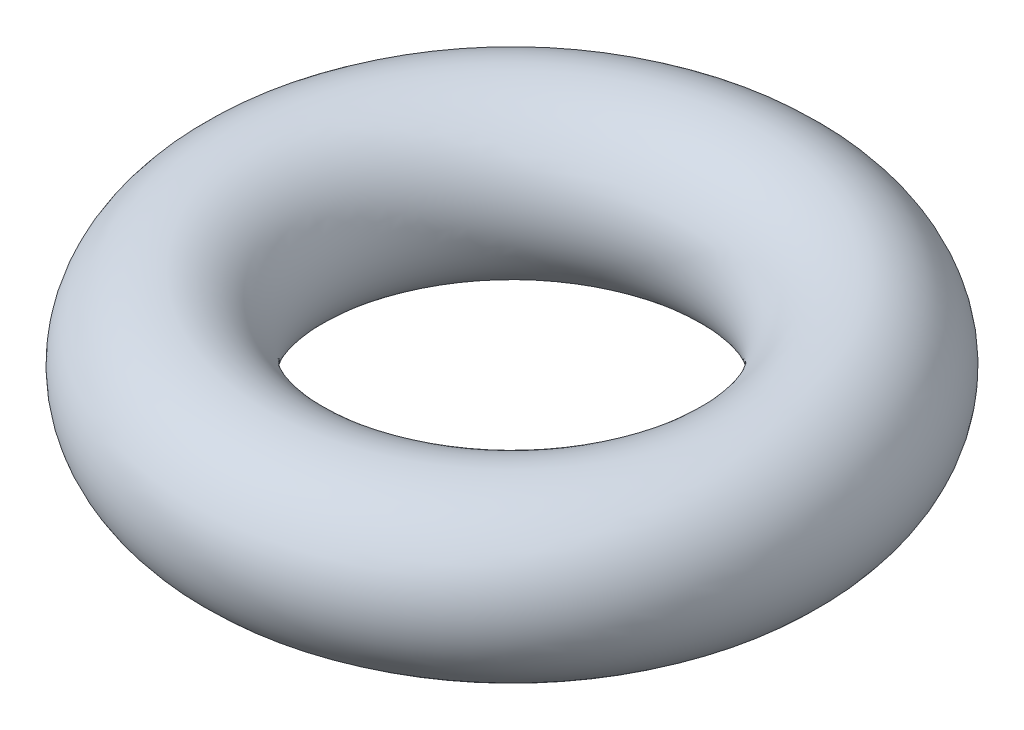
ISO-10303-21;
HEADER;
FILE_DESCRIPTION(('STEP AP214'),'2;1');
FILE_NAME('part.step','',(''),(''),'','','');
FILE_SCHEMA(('AUTOMOTIVE_DESIGN { 1 0 10303 214 1 1 1 1 }'));
ENDSEC;
DATA;
#1=APPLICATION_CONTEXT('core data for automotive mechanical design processes');
#2=APPLICATION_PROTOCOL_DEFINITION('international standard','automotive_design',2000,#1);
#3=PRODUCT_CONTEXT('',#1,'mechanical');
#4=PRODUCT('Part','Part','',(#3));
#5=PRODUCT_RELATED_PRODUCT_CATEGORY('part','',(#4));
#6=PRODUCT_DEFINITION_FORMATION('','',#4);
#7=PRODUCT_DEFINITION_CONTEXT('part definition',#1,'design');
#8=PRODUCT_DEFINITION('design','',#6,#7);
#9=PRODUCT_DEFINITION_SHAPE('','',#8);
#10=(LENGTH_UNIT() NAMED_UNIT(*) SI_UNIT(.MILLI.,.METRE.));
#11=(NAMED_UNIT(*) PLANE_ANGLE_UNIT() SI_UNIT($,.RADIAN.));
#12=(NAMED_UNIT(*) SI_UNIT($,.STERADIAN.) SOLID_ANGLE_UNIT());
#13=UNCERTAINTY_MEASURE_WITH_UNIT(LENGTH_MEASURE(1.E-05),#10,'distance_accuracy_value','');
#14=(GEOMETRIC_REPRESENTATION_CONTEXT(3) GLOBAL_UNCERTAINTY_ASSIGNED_CONTEXT((#13)) GLOBAL_UNIT_ASSIGNED_CONTEXT((#10,
#11,#12)) REPRESENTATION_CONTEXT('',''));
#15=CARTESIAN_POINT('',(0.,0.,0.));
#16=DIRECTION('',(0.,0.,1.));
#17=DIRECTION('',(1.,0.,0.));
#18=AXIS2_PLACEMENT_3D('',#15,#16,#17);
#19=CARTESIAN_POINT('',(0.,0.,0.));
#20=DIRECTION('',(0.,1.,0.));
#21=DIRECTION('',(0.,0.,1.));
#22=AXIS2_PLACEMENT_3D('',#19,#20,#21);
#23=TOROIDAL_SURFACE('',#22,7.5,2.5);
#24=CARTESIAN_POINT('',(0.,0.,10.));
#25=VERTEX_POINT('',#24);
#26=VERTEX_LOOP('',#25);
#27=FACE_BOUND('',#26,.T.);
#28=ADVANCED_FACE('F33',(#27),#23,.T.);
#29=CLOSED_SHELL('',(#28));
#30=MANIFOLD_SOLID_BREP('B2',#29);
#31=ADVANCED_BREP_SHAPE_REPRESENTATION('',(#18,#30),#14);
#32=SHAPE_DEFINITION_REPRESENTATION(#9,#31);
ENDSEC;
END-ISO-10303-21;
